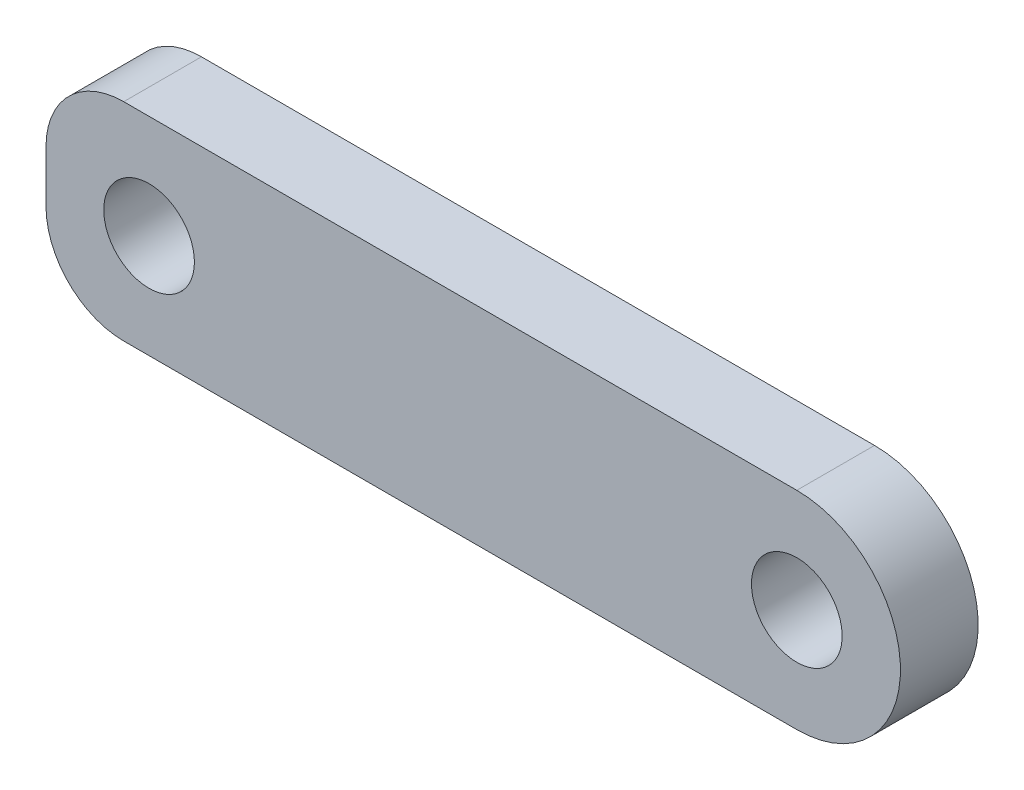
ISO-10303-21;
HEADER;
FILE_DESCRIPTION(('STEP AP214'),'2;1');
FILE_NAME('part.step','',(''),(''),'','','');
FILE_SCHEMA(('AUTOMOTIVE_DESIGN { 1 0 10303 214 1 1 1 1 }'));
ENDSEC;
DATA;
#1=APPLICATION_CONTEXT('core data for automotive mechanical design processes');
#2=APPLICATION_PROTOCOL_DEFINITION('international standard','automotive_design',2000,#1);
#3=PRODUCT_CONTEXT('',#1,'mechanical');
#4=PRODUCT('Part','Part','',(#3));
#5=PRODUCT_RELATED_PRODUCT_CATEGORY('part','',(#4));
#6=PRODUCT_DEFINITION_FORMATION('','',#4);
#7=PRODUCT_DEFINITION_CONTEXT('part definition',#1,'design');
#8=PRODUCT_DEFINITION('design','',#6,#7);
#9=PRODUCT_DEFINITION_SHAPE('','',#8);
#10=(LENGTH_UNIT() NAMED_UNIT(*) SI_UNIT(.MILLI.,.METRE.));
#11=(NAMED_UNIT(*) PLANE_ANGLE_UNIT() SI_UNIT($,.RADIAN.));
#12=(NAMED_UNIT(*) SI_UNIT($,.STERADIAN.) SOLID_ANGLE_UNIT());
#13=UNCERTAINTY_MEASURE_WITH_UNIT(LENGTH_MEASURE(1.E-05),#10,'distance_accuracy_value','');
#14=(GEOMETRIC_REPRESENTATION_CONTEXT(3) GLOBAL_UNCERTAINTY_ASSIGNED_CONTEXT((#13)) GLOBAL_UNIT_ASSIGNED_CONTEXT((#10,
#11,#12)) REPRESENTATION_CONTEXT('',''));
#15=CARTESIAN_POINT('',(0.,0.,0.));
#16=DIRECTION('',(0.,0.,1.));
#17=DIRECTION('',(1.,0.,0.));
#18=AXIS2_PLACEMENT_3D('',#15,#16,#17);
#19=CARTESIAN_POINT('',(-14.2391720422732,149.337894443762,-39.9999989718199));
#20=DIRECTION('',(0.,0.,1.));
#21=DIRECTION('',(1.,0.,0.));
#22=AXIS2_PLACEMENT_3D('',#19,#20,#21);
#23=PLANE('',#22);
#24=CARTESIAN_POINT('',(-3.,149.337894443762,-39.9999989718199));
#25=DIRECTION('',(0.,0.,-1.));
#26=DIRECTION('',(1.,0.,0.));
#27=AXIS2_PLACEMENT_3D('',#24,#25,#26);
#28=CIRCLE('',#27,1.75);
#29=CARTESIAN_POINT('',(-4.75,149.337894443762,-39.9999989718199));
#30=VERTEX_POINT('',#29);
#31=EDGE_CURVE('E44',#30,#30,#28,.T.);
#32=ORIENTED_EDGE('',*,*,#31,.F.);
#33=EDGE_LOOP('',(#32));
#34=FACE_BOUND('',#33,.T.);
#35=CARTESIAN_POINT('',(-28.,149.337894443762,-39.9999989718199));
#36=DIRECTION('',(0.,0.,1.));
#37=DIRECTION('',(-1.,0.,0.));
#38=AXIS2_PLACEMENT_3D('',#35,#36,#37);
#39=CIRCLE('',#38,1.75);
#40=CARTESIAN_POINT('',(-26.25,149.337894443762,-39.9999989718199));
#41=VERTEX_POINT('',#40);
#42=EDGE_CURVE('E57',#41,#41,#39,.T.);
#43=ORIENTED_EDGE('',*,*,#42,.T.);
#44=EDGE_LOOP('',(#43));
#45=FACE_BOUND('',#44,.T.);
#46=CARTESIAN_POINT('',(-28.9783440845464,148.337894443762,-39.9999989718199));
#47=DIRECTION('',(0.,0.,1.));
#48=DIRECTION('',(-0.707106781186546,-0.707106781186549,0.));
#49=AXIS2_PLACEMENT_3D('',#46,#47,#48);
#50=CIRCLE('',#49,3.);
#51=CARTESIAN_POINT('',(-31.9783440845464,148.337894443762,-39.9999989718199));
#52=VERTEX_POINT('',#51);
#53=CARTESIAN_POINT('',(-28.9783440845464,145.337894443762,-39.9999989718199));
#54=VERTEX_POINT('',#53);
#55=EDGE_CURVE('E131',#52,#54,#50,.T.);
#56=ORIENTED_EDGE('',*,*,#55,.F.);
#57=DIRECTION('',(0.,-1.,0.));
#58=VECTOR('',#57,1.);
#59=CARTESIAN_POINT('',(-31.9783440845464,151.337894443762,-39.9999989718199));
#60=LINE('',#59,#58);
#61=CARTESIAN_POINT('',(-31.9783440845464,150.337894443762,-39.9999989718199));
#62=VERTEX_POINT('',#61);
#63=EDGE_CURVE('E123',#62,#52,#60,.T.);
#64=ORIENTED_EDGE('',*,*,#63,.F.);
#65=CARTESIAN_POINT('',(-28.9783440845464,150.337894443762,-39.9999989718199));
#66=DIRECTION('',(0.,0.,1.));
#67=DIRECTION('',(-0.707106781186546,0.707106781186549,0.));
#68=AXIS2_PLACEMENT_3D('',#65,#66,#67);
#69=CIRCLE('',#68,3.);
#70=CARTESIAN_POINT('',(-28.9783440845464,153.337894443762,-39.9999989718199));
#71=VERTEX_POINT('',#70);
#72=EDGE_CURVE('E115',#71,#62,#69,.T.);
#73=ORIENTED_EDGE('',*,*,#72,.F.);
#74=DIRECTION('',(-1.,0.,0.));
#75=VECTOR('',#74,1.);
#76=CARTESIAN_POINT('',(23.4783440845464,153.337894443762,-39.9999989718199));
#77=LINE('',#76,#75);
#78=CARTESIAN_POINT('',(-3.,153.337894443762,-39.9999989718199));
#79=VERTEX_POINT('',#78);
#80=EDGE_CURVE('E103',#79,#71,#77,.T.);
#81=ORIENTED_EDGE('',*,*,#80,.F.);
#82=CARTESIAN_POINT('',(-3.,149.337894443762,-39.9999989718199));
#83=DIRECTION('',(0.,0.,1.));
#84=DIRECTION('',(1.,0.,0.));
#85=AXIS2_PLACEMENT_3D('',#82,#83,#84);
#86=CIRCLE('',#85,4.);
#87=CARTESIAN_POINT('',(-3.,145.337894443762,-39.9999989718199));
#88=VERTEX_POINT('',#87);
#89=EDGE_CURVE('E11',#88,#79,#86,.T.);
#90=ORIENTED_EDGE('',*,*,#89,.F.);
#91=DIRECTION('',(1.,0.,0.));
#92=VECTOR('',#91,1.);
#93=CARTESIAN_POINT('',(-29.4783440845464,145.337894443762,-39.9999989718199));
#94=LINE('',#93,#92);
#95=EDGE_CURVE('E110',#54,#88,#94,.T.);
#96=ORIENTED_EDGE('',*,*,#95,.F.);
#97=EDGE_LOOP('',(#56,#64,#73,#81,#90,#96));
#98=FACE_BOUND('',#97,.T.);
#99=ADVANCED_FACE('F36',(#34,#45,#98),#23,.F.);
#100=CARTESIAN_POINT('',(-3.,149.337894443762,-39.9999989718199));
#101=DIRECTION('',(0.,0.,1.));
#102=DIRECTION('',(1.,0.,0.));
#103=AXIS2_PLACEMENT_3D('',#100,#101,#102);
#104=CYLINDRICAL_SURFACE('',#103,4.);
#105=ORIENTED_EDGE('',*,*,#89,.T.);
#106=DIRECTION('',(0.,0.,1.));
#107=VECTOR('',#106,1.);
#108=CARTESIAN_POINT('',(-3.,153.337894443762,-39.9999989718199));
#109=LINE('',#108,#107);
#110=CARTESIAN_POINT('',(-3.,153.337894443762,-36.9999989718199));
#111=VERTEX_POINT('',#110);
#112=EDGE_CURVE('E74',#79,#111,#109,.T.);
#113=ORIENTED_EDGE('',*,*,#112,.T.);
#114=CARTESIAN_POINT('',(-3.,149.337894443762,-36.9999989718199));
#115=DIRECTION('',(0.,0.,1.));
#116=DIRECTION('',(1.,0.,0.));
#117=AXIS2_PLACEMENT_3D('',#114,#115,#116);
#118=CIRCLE('',#117,4.);
#119=CARTESIAN_POINT('',(-3.,145.337894443762,-36.9999989718199));
#120=VERTEX_POINT('',#119);
#121=EDGE_CURVE('E137',#120,#111,#118,.T.);
#122=ORIENTED_EDGE('',*,*,#121,.F.);
#123=DIRECTION('',(0.,0.,1.));
#124=VECTOR('',#123,1.);
#125=CARTESIAN_POINT('',(-3.,145.337894443762,-39.9999989718199));
#126=LINE('',#125,#124);
#127=EDGE_CURVE('E85',#88,#120,#126,.T.);
#128=ORIENTED_EDGE('',*,*,#127,.F.);
#129=EDGE_LOOP('',(#105,#113,#122,#128));
#130=FACE_BOUND('',#129,.T.);
#131=ADVANCED_FACE('F160',(#130),#104,.T.);
#132=CARTESIAN_POINT('',(-3.,149.337894443762,-39.9999989718199));
#133=DIRECTION('',(0.,0.,1.));
#134=DIRECTION('',(1.,0.,0.));
#135=AXIS2_PLACEMENT_3D('',#132,#133,#134);
#136=CYLINDRICAL_SURFACE('',#135,1.75);
#137=CARTESIAN_POINT('',(-3.,149.337894443762,-36.9999989718199));
#138=DIRECTION('',(0.,0.,-1.));
#139=DIRECTION('',(1.,0.,0.));
#140=AXIS2_PLACEMENT_3D('',#137,#138,#139);
#141=CIRCLE('',#140,1.75);
#142=CARTESIAN_POINT('',(-4.75,149.337894443762,-36.9999989718199));
#143=VERTEX_POINT('',#142);
#144=EDGE_CURVE('E125',#143,#143,#141,.T.);
#145=ORIENTED_EDGE('',*,*,#144,.F.);
#146=DIRECTION('',(0.,0.,-1.));
#147=VECTOR('',#146,1.);
#148=CARTESIAN_POINT('',(-4.75,149.337894443762,-39.9999989718199));
#149=LINE('',#148,#147);
#150=EDGE_CURVE('E148',#143,#30,#149,.T.);
#151=ORIENTED_EDGE('',*,*,#150,.T.);
#152=ORIENTED_EDGE('',*,*,#31,.T.);
#153=ORIENTED_EDGE('',*,*,#150,.F.);
#154=EDGE_LOOP('',(#145,#151,#152,#153));
#155=FACE_BOUND('',#154,.T.);
#156=ADVANCED_FACE('F173',(#155),#136,.F.);
#157=CARTESIAN_POINT('',(-28.,149.337894443762,-36.9999989718199));
#158=DIRECTION('',(0.,0.,-1.));
#159=DIRECTION('',(-1.,0.,0.));
#160=AXIS2_PLACEMENT_3D('',#157,#158,#159);
#161=CYLINDRICAL_SURFACE('',#160,1.75);
#162=CARTESIAN_POINT('',(-28.,149.337894443762,-36.9999989718199));
#163=DIRECTION('',(0.,0.,-1.));
#164=DIRECTION('',(-1.,0.,0.));
#165=AXIS2_PLACEMENT_3D('',#162,#163,#164);
#166=CIRCLE('',#165,1.75);
#167=CARTESIAN_POINT('',(-26.25,149.337894443762,-36.9999989718199));
#168=VERTEX_POINT('',#167);
#169=EDGE_CURVE('E39',#168,#168,#166,.T.);
#170=ORIENTED_EDGE('',*,*,#169,.F.);
#171=DIRECTION('',(0.,0.,-1.));
#172=VECTOR('',#171,1.);
#173=CARTESIAN_POINT('',(-26.25,149.337894443762,-36.9999989718199));
#174=LINE('',#173,#172);
#175=EDGE_CURVE('E146',#168,#41,#174,.T.);
#176=ORIENTED_EDGE('',*,*,#175,.T.);
#177=ORIENTED_EDGE('',*,*,#42,.F.);
#178=ORIENTED_EDGE('',*,*,#175,.F.);
#179=EDGE_LOOP('',(#170,#176,#177,#178));
#180=FACE_BOUND('',#179,.T.);
#181=ADVANCED_FACE('F145',(#180),#161,.F.);
#182=CARTESIAN_POINT('',(-29.4783440845464,145.337894443762,-39.9999989718199));
#183=DIRECTION('',(0.,-1.,0.));
#184=DIRECTION('',(-1.,0.,0.));
#185=AXIS2_PLACEMENT_3D('',#182,#183,#184);
#186=PLANE('',#185);
#187=DIRECTION('',(0.,0.,1.));
#188=VECTOR('',#187,1.);
#189=CARTESIAN_POINT('',(-28.9783440845464,145.337894443762,-39.9999989718199));
#190=LINE('',#189,#188);
#191=CARTESIAN_POINT('',(-28.9783440845464,145.337894443762,-36.9999989718199));
#192=VERTEX_POINT('',#191);
#193=EDGE_CURVE('E134',#54,#192,#190,.T.);
#194=ORIENTED_EDGE('',*,*,#193,.F.);
#195=ORIENTED_EDGE('',*,*,#95,.T.);
#196=ORIENTED_EDGE('',*,*,#127,.T.);
#197=DIRECTION('',(1.,0.,0.));
#198=VECTOR('',#197,1.);
#199=CARTESIAN_POINT('',(-29.4783440845464,145.337894443762,-36.9999989718199));
#200=LINE('',#199,#198);
#201=EDGE_CURVE('E155',#192,#120,#200,.T.);
#202=ORIENTED_EDGE('',*,*,#201,.F.);
#203=EDGE_LOOP('',(#194,#195,#196,#202));
#204=FACE_BOUND('',#203,.T.);
#205=ADVANCED_FACE('F157',(#204),#186,.T.);
#206=CARTESIAN_POINT('',(-3.,153.337894443762,-39.9999989718199));
#207=DIRECTION('',(0.,1.,0.));
#208=DIRECTION('',(1.,0.,0.));
#209=AXIS2_PLACEMENT_3D('',#206,#207,#208);
#210=PLANE('',#209);
#211=DIRECTION('',(0.,0.,-1.));
#212=VECTOR('',#211,1.);
#213=CARTESIAN_POINT('',(-28.9783440845464,153.337894443762,-39.9999989718199));
#214=LINE('',#213,#212);
#215=CARTESIAN_POINT('',(-28.9783440845464,153.337894443762,-36.9999989718199));
#216=VERTEX_POINT('',#215);
#217=EDGE_CURVE('E106',#216,#71,#214,.T.);
#218=ORIENTED_EDGE('',*,*,#217,.F.);
#219=DIRECTION('',(-1.,0.,0.));
#220=VECTOR('',#219,1.);
#221=CARTESIAN_POINT('',(23.4783440845464,153.337894443762,-36.9999989718199));
#222=LINE('',#221,#220);
#223=EDGE_CURVE('E136',#111,#216,#222,.T.);
#224=ORIENTED_EDGE('',*,*,#223,.F.);
#225=ORIENTED_EDGE('',*,*,#112,.F.);
#226=ORIENTED_EDGE('',*,*,#80,.T.);
#227=EDGE_LOOP('',(#218,#224,#225,#226));
#228=FACE_BOUND('',#227,.T.);
#229=ADVANCED_FACE('F105',(#228),#210,.T.);
#230=CARTESIAN_POINT('',(-28.9783440845464,150.337894443762,-39.9999989718199));
#231=DIRECTION('',(0.,0.,-1.));
#232=DIRECTION('',(-0.707106781186546,0.707106781186549,0.));
#233=AXIS2_PLACEMENT_3D('',#230,#231,#232);
#234=CYLINDRICAL_SURFACE('',#233,3.);
#235=ORIENTED_EDGE('',*,*,#72,.T.);
#236=DIRECTION('',(0.,0.,1.));
#237=VECTOR('',#236,1.);
#238=CARTESIAN_POINT('',(-31.9783440845464,150.337894443762,-39.9999989718199));
#239=LINE('',#238,#237);
#240=CARTESIAN_POINT('',(-31.9783440845464,150.337894443762,-36.9999989718199));
#241=VERTEX_POINT('',#240);
#242=EDGE_CURVE('E167',#62,#241,#239,.T.);
#243=ORIENTED_EDGE('',*,*,#242,.T.);
#244=CARTESIAN_POINT('',(-28.9783440845464,150.337894443762,-36.9999989718199));
#245=DIRECTION('',(0.,0.,-1.));
#246=DIRECTION('',(-0.707106781186546,0.707106781186549,0.));
#247=AXIS2_PLACEMENT_3D('',#244,#245,#246);
#248=CIRCLE('',#247,3.);
#249=EDGE_CURVE('E118',#241,#216,#248,.T.);
#250=ORIENTED_EDGE('',*,*,#249,.T.);
#251=ORIENTED_EDGE('',*,*,#217,.T.);
#252=EDGE_LOOP('',(#235,#243,#250,#251));
#253=FACE_BOUND('',#252,.T.);
#254=ADVANCED_FACE('F113',(#253),#234,.T.);
#255=CARTESIAN_POINT('',(-14.2391720422732,149.337894443762,-36.9999989718199));
#256=DIRECTION('',(0.,0.,1.));
#257=DIRECTION('',(1.,0.,0.));
#258=AXIS2_PLACEMENT_3D('',#255,#256,#257);
#259=PLANE('',#258);
#260=ORIENTED_EDGE('',*,*,#144,.T.);
#261=EDGE_LOOP('',(#260));
#262=FACE_BOUND('',#261,.T.);
#263=ORIENTED_EDGE('',*,*,#169,.T.);
#264=EDGE_LOOP('',(#263));
#265=FACE_BOUND('',#264,.T.);
#266=CARTESIAN_POINT('',(-28.9783440845464,148.337894443762,-36.9999989718199));
#267=DIRECTION('',(0.,0.,-1.));
#268=DIRECTION('',(-0.707106781186546,-0.707106781186549,0.));
#269=AXIS2_PLACEMENT_3D('',#266,#267,#268);
#270=CIRCLE('',#269,3.);
#271=CARTESIAN_POINT('',(-31.9783440845464,148.337894443762,-36.9999989718199));
#272=VERTEX_POINT('',#271);
#273=EDGE_CURVE('E165',#192,#272,#270,.T.);
#274=ORIENTED_EDGE('',*,*,#273,.F.);
#275=ORIENTED_EDGE('',*,*,#201,.T.);
#276=ORIENTED_EDGE('',*,*,#121,.T.);
#277=ORIENTED_EDGE('',*,*,#223,.T.);
#278=ORIENTED_EDGE('',*,*,#249,.F.);
#279=DIRECTION('',(0.,-1.,0.));
#280=VECTOR('',#279,1.);
#281=CARTESIAN_POINT('',(-31.9783440845464,151.337894443762,-36.9999989718199));
#282=LINE('',#281,#280);
#283=EDGE_CURVE('E170',#241,#272,#282,.T.);
#284=ORIENTED_EDGE('',*,*,#283,.T.);
#285=EDGE_LOOP('',(#274,#275,#276,#277,#278,#284));
#286=FACE_BOUND('',#285,.T.);
#287=ADVANCED_FACE('F141',(#262,#265,#286),#259,.T.);
#288=CARTESIAN_POINT('',(-31.9783440845464,153.337894443762,-39.9999989718199));
#289=DIRECTION('',(-1.,0.,0.));
#290=DIRECTION('',(0.,0.,1.));
#291=AXIS2_PLACEMENT_3D('',#288,#289,#290);
#292=PLANE('',#291);
#293=DIRECTION('',(0.,0.,-1.));
#294=VECTOR('',#293,1.);
#295=CARTESIAN_POINT('',(-31.9783440845464,148.337894443762,-39.9999989718199));
#296=LINE('',#295,#294);
#297=EDGE_CURVE('E135',#272,#52,#296,.T.);
#298=ORIENTED_EDGE('',*,*,#297,.F.);
#299=ORIENTED_EDGE('',*,*,#283,.F.);
#300=ORIENTED_EDGE('',*,*,#242,.F.);
#301=ORIENTED_EDGE('',*,*,#63,.T.);
#302=EDGE_LOOP('',(#298,#299,#300,#301));
#303=FACE_BOUND('',#302,.T.);
#304=ADVANCED_FACE('F176',(#303),#292,.T.);
#305=CARTESIAN_POINT('',(-28.9783440845464,148.337894443762,-39.9999989718199));
#306=DIRECTION('',(0.,0.,1.));
#307=DIRECTION('',(-0.707106781186546,-0.707106781186549,0.));
#308=AXIS2_PLACEMENT_3D('',#305,#306,#307);
#309=CYLINDRICAL_SURFACE('',#308,3.);
#310=ORIENTED_EDGE('',*,*,#273,.T.);
#311=ORIENTED_EDGE('',*,*,#297,.T.);
#312=ORIENTED_EDGE('',*,*,#55,.T.);
#313=ORIENTED_EDGE('',*,*,#193,.T.);
#314=EDGE_LOOP('',(#310,#311,#312,#313));
#315=FACE_BOUND('',#314,.T.);
#316=ADVANCED_FACE('F182',(#315),#309,.T.);
#317=CLOSED_SHELL('',(#99,#131,#156,#181,#205,#229,#254,#287,#304,#316));
#318=MANIFOLD_SOLID_BREP('B2',#317);
#319=ADVANCED_BREP_SHAPE_REPRESENTATION('',(#18,#318),#14);
#320=SHAPE_DEFINITION_REPRESENTATION(#9,#319);
ENDSEC;
END-ISO-10303-21;
